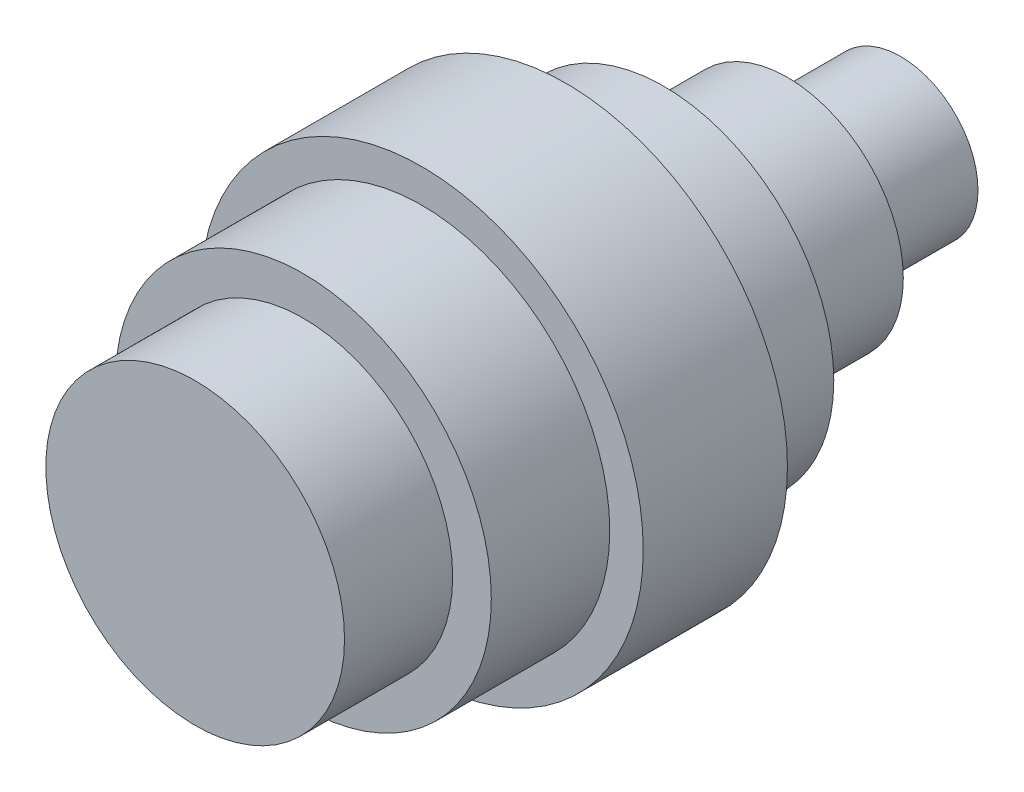
ISO-10303-21;
HEADER;
FILE_DESCRIPTION(('STEP AP214'),'2;1');
FILE_NAME('part.step','',(''),(''),'','','');
FILE_SCHEMA(('AUTOMOTIVE_DESIGN { 1 0 10303 214 1 1 1 1 }'));
ENDSEC;
DATA;
#1=APPLICATION_CONTEXT('core data for automotive mechanical design processes');
#2=APPLICATION_PROTOCOL_DEFINITION('international standard','automotive_design',2000,#1);
#3=PRODUCT_CONTEXT('',#1,'mechanical');
#4=PRODUCT('Part','Part','',(#3));
#5=PRODUCT_RELATED_PRODUCT_CATEGORY('part','',(#4));
#6=PRODUCT_DEFINITION_FORMATION('','',#4);
#7=PRODUCT_DEFINITION_CONTEXT('part definition',#1,'design');
#8=PRODUCT_DEFINITION('design','',#6,#7);
#9=PRODUCT_DEFINITION_SHAPE('','',#8);
#10=(LENGTH_UNIT() NAMED_UNIT(*) SI_UNIT(.MILLI.,.METRE.));
#11=(NAMED_UNIT(*) PLANE_ANGLE_UNIT() SI_UNIT($,.RADIAN.));
#12=(NAMED_UNIT(*) SI_UNIT($,.STERADIAN.) SOLID_ANGLE_UNIT());
#13=UNCERTAINTY_MEASURE_WITH_UNIT(LENGTH_MEASURE(1.E-05),#10,'distance_accuracy_value','');
#14=(GEOMETRIC_REPRESENTATION_CONTEXT(3) GLOBAL_UNCERTAINTY_ASSIGNED_CONTEXT((#13)) GLOBAL_UNIT_ASSIGNED_CONTEXT((#10,
#11,#12)) REPRESENTATION_CONTEXT('',''));
#15=CARTESIAN_POINT('',(0.,0.,0.));
#16=DIRECTION('',(0.,0.,1.));
#17=DIRECTION('',(1.,0.,0.));
#18=AXIS2_PLACEMENT_3D('',#15,#16,#17);
#19=CARTESIAN_POINT('',(0.,0.,-68.5));
#20=DIRECTION('',(0.,0.,1.));
#21=DIRECTION('',(1.,0.,0.));
#22=AXIS2_PLACEMENT_3D('',#19,#20,#21);
#23=PLANE('',#22);
#24=CARTESIAN_POINT('',(0.,0.,-68.5));
#25=DIRECTION('',(0.,0.,1.));
#26=DIRECTION('',(1.,0.,0.));
#27=AXIS2_PLACEMENT_3D('',#24,#25,#26);
#28=CIRCLE('',#27,7.5);
#29=CARTESIAN_POINT('',(7.5,0.,-68.5));
#30=VERTEX_POINT('',#29);
#31=EDGE_CURVE('E10',#30,#30,#28,.T.);
#32=ORIENTED_EDGE('',*,*,#31,.F.);
#33=EDGE_LOOP('',(#32));
#34=FACE_BOUND('',#33,.T.);
#35=ADVANCED_FACE('F32',(#34),#23,.F.);
#36=CARTESIAN_POINT('',(0.,0.,-22.));
#37=DIRECTION('',(0.,0.,1.));
#38=DIRECTION('',(1.,0.,0.));
#39=AXIS2_PLACEMENT_3D('',#36,#37,#38);
#40=CYLINDRICAL_SURFACE('',#39,7.5);
#41=ORIENTED_EDGE('',*,*,#31,.T.);
#42=EDGE_LOOP('',(#41));
#43=FACE_BOUND('',#42,.T.);
#44=CARTESIAN_POINT('',(0.,0.,-57.5));
#45=DIRECTION('',(0.,0.,1.));
#46=DIRECTION('',(1.,0.,0.));
#47=AXIS2_PLACEMENT_3D('',#44,#45,#46);
#48=CIRCLE('',#47,7.5);
#49=CARTESIAN_POINT('',(7.5,0.,-57.5));
#50=VERTEX_POINT('',#49);
#51=EDGE_CURVE('E38',#50,#50,#48,.T.);
#52=ORIENTED_EDGE('',*,*,#51,.F.);
#53=EDGE_LOOP('',(#52));
#54=FACE_BOUND('',#53,.T.);
#55=ADVANCED_FACE('F92',(#43,#54),#40,.T.);
#56=CARTESIAN_POINT('',(0.,0.,-57.5));
#57=DIRECTION('',(0.,0.,1.));
#58=DIRECTION('',(1.,0.,0.));
#59=AXIS2_PLACEMENT_3D('',#56,#57,#58);
#60=PLANE('',#59);
#61=CARTESIAN_POINT('',(0.,0.,-57.5));
#62=DIRECTION('',(0.,0.,1.));
#63=DIRECTION('',(1.,0.,0.));
#64=AXIS2_PLACEMENT_3D('',#61,#62,#63);
#65=CIRCLE('',#64,11.25);
#66=CARTESIAN_POINT('',(11.25,0.,-57.5));
#67=VERTEX_POINT('',#66);
#68=EDGE_CURVE('E42',#67,#67,#65,.T.);
#69=ORIENTED_EDGE('',*,*,#68,.F.);
#70=EDGE_LOOP('',(#69));
#71=FACE_BOUND('',#70,.T.);
#72=ORIENTED_EDGE('',*,*,#51,.T.);
#73=EDGE_LOOP('',(#72));
#74=FACE_BOUND('',#73,.T.);
#75=ADVANCED_FACE('F97',(#71,#74),#60,.F.);
#76=CARTESIAN_POINT('',(0.,0.,-22.));
#77=DIRECTION('',(0.,0.,1.));
#78=DIRECTION('',(1.,0.,0.));
#79=AXIS2_PLACEMENT_3D('',#76,#77,#78);
#80=CYLINDRICAL_SURFACE('',#79,11.25);
#81=ORIENTED_EDGE('',*,*,#68,.T.);
#82=EDGE_LOOP('',(#81));
#83=FACE_BOUND('',#82,.T.);
#84=CARTESIAN_POINT('',(0.,0.,-45.5));
#85=DIRECTION('',(0.,0.,1.));
#86=DIRECTION('',(1.,0.,0.));
#87=AXIS2_PLACEMENT_3D('',#84,#85,#86);
#88=CIRCLE('',#87,11.25);
#89=CARTESIAN_POINT('',(11.25,0.,-45.5));
#90=VERTEX_POINT('',#89);
#91=EDGE_CURVE('E46',#90,#90,#88,.T.);
#92=ORIENTED_EDGE('',*,*,#91,.F.);
#93=EDGE_LOOP('',(#92));
#94=FACE_BOUND('',#93,.T.);
#95=ADVANCED_FACE('F101',(#83,#94),#80,.T.);
#96=CARTESIAN_POINT('',(0.,0.,-45.5));
#97=DIRECTION('',(0.,0.,1.));
#98=DIRECTION('',(1.,0.,0.));
#99=AXIS2_PLACEMENT_3D('',#96,#97,#98);
#100=PLANE('',#99);
#101=CARTESIAN_POINT('',(0.,0.,-45.5));
#102=DIRECTION('',(0.,0.,1.));
#103=DIRECTION('',(1.,0.,0.));
#104=AXIS2_PLACEMENT_3D('',#101,#102,#103);
#105=CIRCLE('',#104,16.5);
#106=CARTESIAN_POINT('',(16.5,0.,-45.5));
#107=VERTEX_POINT('',#106);
#108=EDGE_CURVE('E51',#107,#107,#105,.T.);
#109=ORIENTED_EDGE('',*,*,#108,.F.);
#110=EDGE_LOOP('',(#109));
#111=FACE_BOUND('',#110,.T.);
#112=ORIENTED_EDGE('',*,*,#91,.T.);
#113=EDGE_LOOP('',(#112));
#114=FACE_BOUND('',#113,.T.);
#115=ADVANCED_FACE('F108',(#111,#114),#100,.F.);
#116=CARTESIAN_POINT('',(0.,0.,-22.));
#117=DIRECTION('',(0.,0.,1.));
#118=DIRECTION('',(1.,0.,0.));
#119=AXIS2_PLACEMENT_3D('',#116,#117,#118);
#120=CYLINDRICAL_SURFACE('',#119,16.5);
#121=ORIENTED_EDGE('',*,*,#108,.T.);
#122=EDGE_LOOP('',(#121));
#123=FACE_BOUND('',#122,.T.);
#124=CARTESIAN_POINT('',(0.,0.,-36.));
#125=DIRECTION('',(0.,0.,1.));
#126=DIRECTION('',(1.,0.,0.));
#127=AXIS2_PLACEMENT_3D('',#124,#125,#126);
#128=CIRCLE('',#127,16.5);
#129=CARTESIAN_POINT('',(16.5,0.,-36.));
#130=VERTEX_POINT('',#129);
#131=EDGE_CURVE('E54',#130,#130,#128,.T.);
#132=ORIENTED_EDGE('',*,*,#131,.F.);
#133=EDGE_LOOP('',(#132));
#134=FACE_BOUND('',#133,.T.);
#135=ADVANCED_FACE('F112',(#123,#134),#120,.T.);
#136=CARTESIAN_POINT('',(0.,0.,-36.));
#137=DIRECTION('',(0.,0.,1.));
#138=DIRECTION('',(1.,0.,0.));
#139=AXIS2_PLACEMENT_3D('',#136,#137,#138);
#140=PLANE('',#139);
#141=CARTESIAN_POINT('',(0.,0.,-36.));
#142=DIRECTION('',(0.,0.,1.));
#143=DIRECTION('',(1.,0.,0.));
#144=AXIS2_PLACEMENT_3D('',#141,#142,#143);
#145=CIRCLE('',#144,21.5);
#146=CARTESIAN_POINT('',(21.5,0.,-36.));
#147=VERTEX_POINT('',#146);
#148=EDGE_CURVE('E57',#147,#147,#145,.T.);
#149=ORIENTED_EDGE('',*,*,#148,.F.);
#150=EDGE_LOOP('',(#149));
#151=FACE_BOUND('',#150,.T.);
#152=ORIENTED_EDGE('',*,*,#131,.T.);
#153=EDGE_LOOP('',(#152));
#154=FACE_BOUND('',#153,.T.);
#155=ADVANCED_FACE('F116',(#151,#154),#140,.F.);
#156=CARTESIAN_POINT('',(0.,0.,-22.));
#157=DIRECTION('',(0.,0.,1.));
#158=DIRECTION('',(1.,0.,0.));
#159=AXIS2_PLACEMENT_3D('',#156,#157,#158);
#160=CYLINDRICAL_SURFACE('',#159,21.5);
#161=ORIENTED_EDGE('',*,*,#148,.T.);
#162=EDGE_LOOP('',(#161));
#163=FACE_BOUND('',#162,.T.);
#164=CARTESIAN_POINT('',(0.,0.,-22.));
#165=DIRECTION('',(0.,0.,1.));
#166=DIRECTION('',(1.,0.,0.));
#167=AXIS2_PLACEMENT_3D('',#164,#165,#166);
#168=CIRCLE('',#167,21.5);
#169=CARTESIAN_POINT('',(21.5,0.,-22.));
#170=VERTEX_POINT('',#169);
#171=EDGE_CURVE('E60',#170,#170,#168,.T.);
#172=ORIENTED_EDGE('',*,*,#171,.F.);
#173=EDGE_LOOP('',(#172));
#174=FACE_BOUND('',#173,.T.);
#175=ADVANCED_FACE('F120',(#163,#174),#160,.T.);
#176=CARTESIAN_POINT('',(0.,0.,-22.));
#177=DIRECTION('',(0.,0.,1.));
#178=DIRECTION('',(1.,0.,0.));
#179=AXIS2_PLACEMENT_3D('',#176,#177,#178);
#180=PLANE('',#179);
#181=ORIENTED_EDGE('',*,*,#171,.T.);
#182=EDGE_LOOP('',(#181));
#183=FACE_BOUND('',#182,.T.);
#184=CARTESIAN_POINT('',(0.,0.,-22.));
#185=DIRECTION('',(0.,0.,1.));
#186=DIRECTION('',(1.,0.,0.));
#187=AXIS2_PLACEMENT_3D('',#184,#185,#186);
#188=CIRCLE('',#187,18.25);
#189=CARTESIAN_POINT('',(18.25,0.,-22.));
#190=VERTEX_POINT('',#189);
#191=EDGE_CURVE('E63',#190,#190,#188,.T.);
#192=ORIENTED_EDGE('',*,*,#191,.F.);
#193=EDGE_LOOP('',(#192));
#194=FACE_BOUND('',#193,.T.);
#195=ADVANCED_FACE('F124',(#183,#194),#180,.T.);
#196=CARTESIAN_POINT('',(0.,0.,-22.));
#197=DIRECTION('',(0.,0.,1.));
#198=DIRECTION('',(1.,0.,0.));
#199=AXIS2_PLACEMENT_3D('',#196,#197,#198);
#200=CYLINDRICAL_SURFACE('',#199,18.25);
#201=ORIENTED_EDGE('',*,*,#191,.T.);
#202=EDGE_LOOP('',(#201));
#203=FACE_BOUND('',#202,.T.);
#204=CARTESIAN_POINT('',(0.,0.,-10.5));
#205=DIRECTION('',(0.,0.,1.));
#206=DIRECTION('',(1.,0.,0.));
#207=AXIS2_PLACEMENT_3D('',#204,#205,#206);
#208=CIRCLE('',#207,18.25);
#209=CARTESIAN_POINT('',(18.25,0.,-10.5));
#210=VERTEX_POINT('',#209);
#211=EDGE_CURVE('E66',#210,#210,#208,.T.);
#212=ORIENTED_EDGE('',*,*,#211,.F.);
#213=EDGE_LOOP('',(#212));
#214=FACE_BOUND('',#213,.T.);
#215=ADVANCED_FACE('F88',(#203,#214),#200,.T.);
#216=CARTESIAN_POINT('',(0.,0.,-10.5));
#217=DIRECTION('',(0.,0.,1.));
#218=DIRECTION('',(1.,0.,0.));
#219=AXIS2_PLACEMENT_3D('',#216,#217,#218);
#220=PLANE('',#219);
#221=ORIENTED_EDGE('',*,*,#211,.T.);
#222=EDGE_LOOP('',(#221));
#223=FACE_BOUND('',#222,.T.);
#224=CARTESIAN_POINT('',(0.,0.,-10.5));
#225=DIRECTION('',(0.,0.,1.));
#226=DIRECTION('',(1.,0.,0.));
#227=AXIS2_PLACEMENT_3D('',#224,#225,#226);
#228=CIRCLE('',#227,14.5);
#229=CARTESIAN_POINT('',(14.5,0.,-10.5));
#230=VERTEX_POINT('',#229);
#231=EDGE_CURVE('E69',#230,#230,#228,.T.);
#232=ORIENTED_EDGE('',*,*,#231,.F.);
#233=EDGE_LOOP('',(#232));
#234=FACE_BOUND('',#233,.T.);
#235=ADVANCED_FACE('F80',(#223,#234),#220,.T.);
#236=CARTESIAN_POINT('',(0.,0.,-22.));
#237=DIRECTION('',(0.,0.,1.));
#238=DIRECTION('',(1.,0.,0.));
#239=AXIS2_PLACEMENT_3D('',#236,#237,#238);
#240=CYLINDRICAL_SURFACE('',#239,14.5);
#241=ORIENTED_EDGE('',*,*,#231,.T.);
#242=EDGE_LOOP('',(#241));
#243=FACE_BOUND('',#242,.T.);
#244=CARTESIAN_POINT('',(0.,0.,0.));
#245=DIRECTION('',(0.,0.,1.));
#246=DIRECTION('',(1.,0.,0.));
#247=AXIS2_PLACEMENT_3D('',#244,#245,#246);
#248=CIRCLE('',#247,14.5);
#249=CARTESIAN_POINT('',(14.5,0.,0.));
#250=VERTEX_POINT('',#249);
#251=EDGE_CURVE('E72',#250,#250,#248,.T.);
#252=ORIENTED_EDGE('',*,*,#251,.F.);
#253=EDGE_LOOP('',(#252));
#254=FACE_BOUND('',#253,.T.);
#255=ADVANCED_FACE('F78',(#243,#254),#240,.T.);
#256=CARTESIAN_POINT('',(0.,0.,0.));
#257=DIRECTION('',(0.,0.,1.));
#258=DIRECTION('',(1.,0.,0.));
#259=AXIS2_PLACEMENT_3D('',#256,#257,#258);
#260=PLANE('',#259);
#261=ORIENTED_EDGE('',*,*,#251,.T.);
#262=EDGE_LOOP('',(#261));
#263=FACE_BOUND('',#262,.T.);
#264=ADVANCED_FACE('F76',(#263),#260,.T.);
#265=CLOSED_SHELL('',(#35,#55,#75,#95,#115,#135,#155,#175,#195,#215,#235,#255,#264));
#266=MANIFOLD_SOLID_BREP('B2',#265);
#267=ADVANCED_BREP_SHAPE_REPRESENTATION('',(#18,#266),#14);
#268=SHAPE_DEFINITION_REPRESENTATION(#9,#267);
ENDSEC;
END-ISO-10303-21;
